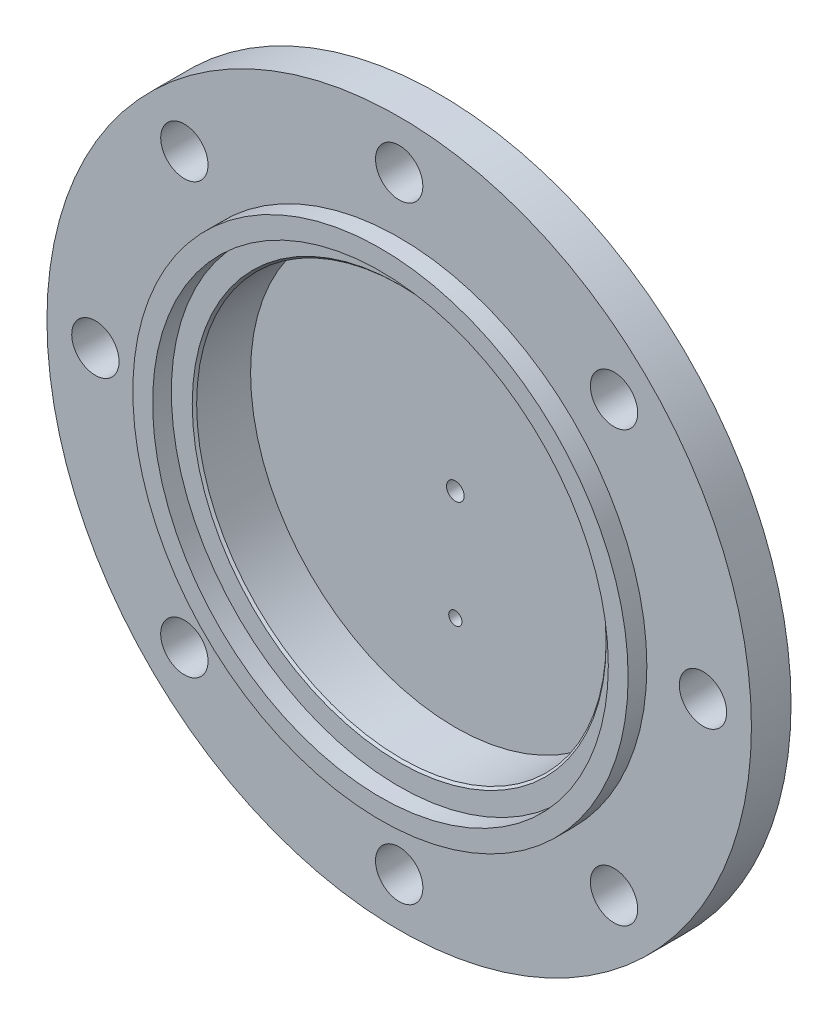
ISO-10303-21;
HEADER;
FILE_DESCRIPTION(('STEP AP214'),'2;1');
FILE_NAME('part.step','',(''),(''),'','','');
FILE_SCHEMA(('AUTOMOTIVE_DESIGN { 1 0 10303 214 1 1 1 1 }'));
ENDSEC;
DATA;
#1=APPLICATION_CONTEXT('core data for automotive mechanical design processes');
#2=APPLICATION_PROTOCOL_DEFINITION('international standard','automotive_design',2000,#1);
#3=PRODUCT_CONTEXT('',#1,'mechanical');
#4=PRODUCT('Part','Part','',(#3));
#5=PRODUCT_RELATED_PRODUCT_CATEGORY('part','',(#4));
#6=PRODUCT_DEFINITION_FORMATION('','',#4);
#7=PRODUCT_DEFINITION_CONTEXT('part definition',#1,'design');
#8=PRODUCT_DEFINITION('design','',#6,#7);
#9=PRODUCT_DEFINITION_SHAPE('','',#8);
#10=(LENGTH_UNIT() NAMED_UNIT(*) SI_UNIT(.MILLI.,.METRE.));
#11=(NAMED_UNIT(*) PLANE_ANGLE_UNIT() SI_UNIT($,.RADIAN.));
#12=(NAMED_UNIT(*) SI_UNIT($,.STERADIAN.) SOLID_ANGLE_UNIT());
#13=UNCERTAINTY_MEASURE_WITH_UNIT(LENGTH_MEASURE(1.E-05),#10,'distance_accuracy_value','');
#14=(GEOMETRIC_REPRESENTATION_CONTEXT(3) GLOBAL_UNCERTAINTY_ASSIGNED_CONTEXT((#13)) GLOBAL_UNIT_ASSIGNED_CONTEXT((#10,
#11,#12)) REPRESENTATION_CONTEXT('',''));
#15=CARTESIAN_POINT('',(0.,0.,0.));
#16=DIRECTION('',(0.,0.,1.));
#17=DIRECTION('',(1.,0.,0.));
#18=AXIS2_PLACEMENT_3D('',#15,#16,#17);
#19=CARTESIAN_POINT('',(0.,0.,18.));
#20=DIRECTION('',(0.,0.,-1.));
#21=DIRECTION('',(-1.,0.,0.));
#22=AXIS2_PLACEMENT_3D('',#19,#20,#21);
#23=CYLINDRICAL_SURFACE('',#22,93.);
#24=CARTESIAN_POINT('',(0.,0.,17.));
#25=DIRECTION('',(0.,0.,1.));
#26=DIRECTION('',(1.,0.,0.));
#27=AXIS2_PLACEMENT_3D('',#24,#25,#26);
#28=CIRCLE('',#27,93.);
#29=CARTESIAN_POINT('',(93.,0.,17.));
#30=VERTEX_POINT('',#29);
#31=EDGE_CURVE('E52',#30,#30,#28,.T.);
#32=ORIENTED_EDGE('',*,*,#31,.T.);
#33=EDGE_LOOP('',(#32));
#34=FACE_BOUND('',#33,.T.);
#35=CARTESIAN_POINT('',(0.,0.,-7.5));
#36=DIRECTION('',(0.,0.,-1.));
#37=DIRECTION('',(-1.,0.,0.));
#38=AXIS2_PLACEMENT_3D('',#35,#36,#37);
#39=CIRCLE('',#38,93.);
#40=CARTESIAN_POINT('',(-93.,0.,-7.5));
#41=VERTEX_POINT('',#40);
#42=EDGE_CURVE('E74',#41,#41,#39,.T.);
#43=ORIENTED_EDGE('',*,*,#42,.T.);
#44=EDGE_LOOP('',(#43));
#45=FACE_BOUND('',#44,.T.);
#46=ADVANCED_FACE('F43',(#34,#45),#23,.F.);
#47=CARTESIAN_POINT('',(0.,0.,18.));
#48=DIRECTION('',(0.,0.,1.));
#49=DIRECTION('',(1.,0.,0.));
#50=AXIS2_PLACEMENT_3D('',#47,#48,#49);
#51=PLANE('',#50);
#52=CARTESIAN_POINT('',(0.,0.,18.));
#53=DIRECTION('',(0.,0.,1.));
#54=DIRECTION('',(1.,0.,0.));
#55=AXIS2_PLACEMENT_3D('',#52,#53,#54);
#56=CIRCLE('',#55,94.);
#57=CARTESIAN_POINT('',(94.,0.,18.));
#58=VERTEX_POINT('',#57);
#59=EDGE_CURVE('E10',#58,#58,#56,.F.);
#60=ORIENTED_EDGE('',*,*,#59,.T.);
#61=EDGE_LOOP('',(#60));
#62=FACE_BOUND('',#61,.T.);
#63=CARTESIAN_POINT('',(0.,0.,18.));
#64=DIRECTION('',(0.,0.,1.));
#65=DIRECTION('',(1.,0.,0.));
#66=AXIS2_PLACEMENT_3D('',#63,#64,#65);
#67=CIRCLE('',#66,103.5);
#68=CARTESIAN_POINT('',(103.5,0.,18.));
#69=VERTEX_POINT('',#68);
#70=EDGE_CURVE('E57',#69,#69,#67,.F.);
#71=ORIENTED_EDGE('',*,*,#70,.F.);
#72=EDGE_LOOP('',(#71));
#73=FACE_BOUND('',#72,.T.);
#74=ADVANCED_FACE('F150',(#62,#73),#51,.T.);
#75=CARTESIAN_POINT('',(0.,0.,0.));
#76=DIRECTION('',(0.,0.,1.));
#77=DIRECTION('',(1.,0.,0.));
#78=AXIS2_PLACEMENT_3D('',#75,#76,#77);
#79=PLANE('',#78);
#80=CARTESIAN_POINT('',(0.,0.,0.));
#81=DIRECTION('',(0.,0.,1.));
#82=DIRECTION('',(1.,0.,0.));
#83=AXIS2_PLACEMENT_3D('',#80,#81,#82);
#84=CIRCLE('',#83,160.);
#85=CARTESIAN_POINT('',(160.,0.,0.));
#86=VERTEX_POINT('',#85);
#87=EDGE_CURVE('E94',#86,#86,#84,.T.);
#88=ORIENTED_EDGE('',*,*,#87,.F.);
#89=EDGE_LOOP('',(#88));
#90=FACE_BOUND('',#89,.T.);
#91=CARTESIAN_POINT('',(0.,138.,0.));
#92=DIRECTION('',(0.,0.,1.));
#93=DIRECTION('',(1.,0.,0.));
#94=AXIS2_PLACEMENT_3D('',#91,#92,#93);
#95=CIRCLE('',#94,10.75);
#96=CARTESIAN_POINT('',(10.75,138.,0.));
#97=VERTEX_POINT('',#96);
#98=EDGE_CURVE('E89',#97,#97,#95,.T.);
#99=ORIENTED_EDGE('',*,*,#98,.T.);
#100=EDGE_LOOP('',(#99));
#101=FACE_BOUND('',#100,.T.);
#102=CARTESIAN_POINT('',(-97.5807358037437,97.5807358037434,0.));
#103=DIRECTION('',(0.,0.,1.));
#104=DIRECTION('',(0.707106781186546,0.707106781186549,0.));
#105=AXIS2_PLACEMENT_3D('',#102,#103,#104);
#106=CIRCLE('',#105,10.75);
#107=CARTESIAN_POINT('',(-89.9793379059884,105.182133701499,0.));
#108=VERTEX_POINT('',#107);
#109=EDGE_CURVE('E104',#108,#108,#106,.T.);
#110=ORIENTED_EDGE('',*,*,#109,.T.);
#111=EDGE_LOOP('',(#110));
#112=FACE_BOUND('',#111,.T.);
#113=CARTESIAN_POINT('',(-138.,-4.81824424760352E-13,0.));
#114=DIRECTION('',(0.,0.,1.));
#115=DIRECTION('',(0.,1.,0.));
#116=AXIS2_PLACEMENT_3D('',#113,#114,#115);
#117=CIRCLE('',#116,10.75);
#118=CARTESIAN_POINT('',(-138.,10.7499999999995,0.));
#119=VERTEX_POINT('',#118);
#120=EDGE_CURVE('E110',#119,#119,#117,.T.);
#121=ORIENTED_EDGE('',*,*,#120,.T.);
#122=EDGE_LOOP('',(#121));
#123=FACE_BOUND('',#122,.T.);
#124=CARTESIAN_POINT('',(-97.580735803743,-97.5807358037441,0.));
#125=DIRECTION('',(0.,0.,1.));
#126=DIRECTION('',(-0.707106781186551,0.707106781186544,0.));
#127=AXIS2_PLACEMENT_3D('',#124,#125,#126);
#128=CIRCLE('',#127,10.75);
#129=CARTESIAN_POINT('',(-105.182133701498,-89.9793379059887,0.));
#130=VERTEX_POINT('',#129);
#131=EDGE_CURVE('E116',#130,#130,#128,.T.);
#132=ORIENTED_EDGE('',*,*,#131,.T.);
#133=EDGE_LOOP('',(#132));
#134=FACE_BOUND('',#133,.T.);
#135=CARTESIAN_POINT('',(0.,-138.,0.));
#136=DIRECTION('',(0.,0.,1.));
#137=DIRECTION('',(-1.,0.,0.));
#138=AXIS2_PLACEMENT_3D('',#135,#136,#137);
#139=CIRCLE('',#138,10.75);
#140=CARTESIAN_POINT('',(-10.75,-138.,0.));
#141=VERTEX_POINT('',#140);
#142=EDGE_CURVE('E122',#141,#141,#139,.T.);
#143=ORIENTED_EDGE('',*,*,#142,.T.);
#144=EDGE_LOOP('',(#143));
#145=FACE_BOUND('',#144,.T.);
#146=CARTESIAN_POINT('',(97.5807358037444,-97.5807358037427,0.));
#147=DIRECTION('',(0.,0.,1.));
#148=DIRECTION('',(-0.707106781186541,-0.707106781186554,0.));
#149=AXIS2_PLACEMENT_3D('',#146,#147,#148);
#150=CIRCLE('',#149,10.75);
#151=CARTESIAN_POINT('',(89.9793379059891,-105.182133701498,0.));
#152=VERTEX_POINT('',#151);
#153=EDGE_CURVE('E128',#152,#152,#150,.T.);
#154=ORIENTED_EDGE('',*,*,#153,.T.);
#155=EDGE_LOOP('',(#154));
#156=FACE_BOUND('',#155,.T.);
#157=CARTESIAN_POINT('',(138.,1.44547327428106E-12,0.));
#158=DIRECTION('',(0.,0.,1.));
#159=DIRECTION('',(0.,-1.,0.));
#160=AXIS2_PLACEMENT_3D('',#157,#158,#159);
#161=CIRCLE('',#160,10.75);
#162=CARTESIAN_POINT('',(138.,-10.7499999999986,0.));
#163=VERTEX_POINT('',#162);
#164=EDGE_CURVE('E134',#163,#163,#161,.T.);
#165=ORIENTED_EDGE('',*,*,#164,.T.);
#166=EDGE_LOOP('',(#165));
#167=FACE_BOUND('',#166,.T.);
#168=CARTESIAN_POINT('',(97.5807358037424,97.5807358037448,0.));
#169=DIRECTION('',(0.,0.,1.));
#170=DIRECTION('',(0.707106781186556,-0.707106781186539,0.));
#171=AXIS2_PLACEMENT_3D('',#168,#169,#170);
#172=CIRCLE('',#171,10.75);
#173=CARTESIAN_POINT('',(105.182133701498,89.9793379059895,0.));
#174=VERTEX_POINT('',#173);
#175=EDGE_CURVE('E140',#174,#174,#172,.T.);
#176=ORIENTED_EDGE('',*,*,#175,.T.);
#177=EDGE_LOOP('',(#176));
#178=FACE_BOUND('',#177,.T.);
#179=CARTESIAN_POINT('',(0.,0.,0.));
#180=DIRECTION('',(0.,0.,1.));
#181=DIRECTION('',(1.,0.,0.));
#182=AXIS2_PLACEMENT_3D('',#179,#180,#181);
#183=CIRCLE('',#182,108.);
#184=CARTESIAN_POINT('',(108.,0.,0.));
#185=VERTEX_POINT('',#184);
#186=EDGE_CURVE('E143',#185,#185,#183,.F.);
#187=ORIENTED_EDGE('',*,*,#186,.F.);
#188=EDGE_LOOP('',(#187));
#189=FACE_BOUND('',#188,.T.);
#190=ADVANCED_FACE('F152',(#90,#101,#112,#123,#134,#145,#156,#167,#178,#189),#79,.F.);
#191=CARTESIAN_POINT('',(97.5807358037424,97.5807358037448,18.));
#192=DIRECTION('',(0.,0.,-1.));
#193=DIRECTION('',(-0.707106781186556,0.707106781186539,0.));
#194=AXIS2_PLACEMENT_3D('',#191,#192,#193);
#195=CYLINDRICAL_SURFACE('',#194,10.75);
#196=CARTESIAN_POINT('',(97.5807358037424,97.5807358037448,18.));
#197=DIRECTION('',(0.,0.,1.));
#198=DIRECTION('',(0.707106781186556,-0.707106781186539,0.));
#199=AXIS2_PLACEMENT_3D('',#196,#197,#198);
#200=CIRCLE('',#199,10.75);
#201=CARTESIAN_POINT('',(105.182133701498,89.9793379059895,18.));
#202=VERTEX_POINT('',#201);
#203=EDGE_CURVE('E137',#202,#202,#200,.T.);
#204=ORIENTED_EDGE('',*,*,#203,.T.);
#205=EDGE_LOOP('',(#204));
#206=FACE_BOUND('',#205,.T.);
#207=ORIENTED_EDGE('',*,*,#175,.F.);
#208=EDGE_LOOP('',(#207));
#209=FACE_BOUND('',#208,.T.);
#210=ADVANCED_FACE('F159',(#206,#209),#195,.F.);
#211=CARTESIAN_POINT('',(138.,1.44547327428106E-12,18.));
#212=DIRECTION('',(0.,0.,-1.));
#213=DIRECTION('',(0.,1.,0.));
#214=AXIS2_PLACEMENT_3D('',#211,#212,#213);
#215=CYLINDRICAL_SURFACE('',#214,10.75);
#216=CARTESIAN_POINT('',(138.,1.44547327428106E-12,18.));
#217=DIRECTION('',(0.,0.,1.));
#218=DIRECTION('',(0.,-1.,0.));
#219=AXIS2_PLACEMENT_3D('',#216,#217,#218);
#220=CIRCLE('',#219,10.75);
#221=CARTESIAN_POINT('',(138.,-10.7499999999986,18.));
#222=VERTEX_POINT('',#221);
#223=EDGE_CURVE('E131',#222,#222,#220,.T.);
#224=ORIENTED_EDGE('',*,*,#223,.T.);
#225=EDGE_LOOP('',(#224));
#226=FACE_BOUND('',#225,.T.);
#227=ORIENTED_EDGE('',*,*,#164,.F.);
#228=EDGE_LOOP('',(#227));
#229=FACE_BOUND('',#228,.T.);
#230=ADVANCED_FACE('F357',(#226,#229),#215,.F.);
#231=CARTESIAN_POINT('',(97.5807358037444,-97.5807358037427,18.));
#232=DIRECTION('',(0.,0.,-1.));
#233=DIRECTION('',(0.707106781186541,0.707106781186554,0.));
#234=AXIS2_PLACEMENT_3D('',#231,#232,#233);
#235=CYLINDRICAL_SURFACE('',#234,10.75);
#236=CARTESIAN_POINT('',(97.5807358037444,-97.5807358037427,18.));
#237=DIRECTION('',(0.,0.,1.));
#238=DIRECTION('',(-0.707106781186541,-0.707106781186554,0.));
#239=AXIS2_PLACEMENT_3D('',#236,#237,#238);
#240=CIRCLE('',#239,10.75);
#241=CARTESIAN_POINT('',(89.9793379059891,-105.182133701498,18.));
#242=VERTEX_POINT('',#241);
#243=EDGE_CURVE('E125',#242,#242,#240,.T.);
#244=ORIENTED_EDGE('',*,*,#243,.T.);
#245=EDGE_LOOP('',(#244));
#246=FACE_BOUND('',#245,.T.);
#247=ORIENTED_EDGE('',*,*,#153,.F.);
#248=EDGE_LOOP('',(#247));
#249=FACE_BOUND('',#248,.T.);
#250=ADVANCED_FACE('F346',(#246,#249),#235,.F.);
#251=CARTESIAN_POINT('',(0.,-138.,18.));
#252=DIRECTION('',(0.,0.,-1.));
#253=DIRECTION('',(1.,0.,0.));
#254=AXIS2_PLACEMENT_3D('',#251,#252,#253);
#255=CYLINDRICAL_SURFACE('',#254,10.75);
#256=CARTESIAN_POINT('',(0.,-138.,18.));
#257=DIRECTION('',(0.,0.,1.));
#258=DIRECTION('',(-1.,0.,0.));
#259=AXIS2_PLACEMENT_3D('',#256,#257,#258);
#260=CIRCLE('',#259,10.75);
#261=CARTESIAN_POINT('',(-10.75,-138.,18.));
#262=VERTEX_POINT('',#261);
#263=EDGE_CURVE('E119',#262,#262,#260,.T.);
#264=ORIENTED_EDGE('',*,*,#263,.T.);
#265=EDGE_LOOP('',(#264));
#266=FACE_BOUND('',#265,.T.);
#267=ORIENTED_EDGE('',*,*,#142,.F.);
#268=EDGE_LOOP('',(#267));
#269=FACE_BOUND('',#268,.T.);
#270=ADVANCED_FACE('F335',(#266,#269),#255,.F.);
#271=CARTESIAN_POINT('',(-97.580735803743,-97.5807358037441,18.));
#272=DIRECTION('',(0.,0.,-1.));
#273=DIRECTION('',(0.707106781186551,-0.707106781186544,0.));
#274=AXIS2_PLACEMENT_3D('',#271,#272,#273);
#275=CYLINDRICAL_SURFACE('',#274,10.75);
#276=CARTESIAN_POINT('',(-97.580735803743,-97.5807358037441,18.));
#277=DIRECTION('',(0.,0.,1.));
#278=DIRECTION('',(-0.707106781186551,0.707106781186544,0.));
#279=AXIS2_PLACEMENT_3D('',#276,#277,#278);
#280=CIRCLE('',#279,10.75);
#281=CARTESIAN_POINT('',(-105.182133701498,-89.9793379059887,18.));
#282=VERTEX_POINT('',#281);
#283=EDGE_CURVE('E113',#282,#282,#280,.T.);
#284=ORIENTED_EDGE('',*,*,#283,.T.);
#285=EDGE_LOOP('',(#284));
#286=FACE_BOUND('',#285,.T.);
#287=ORIENTED_EDGE('',*,*,#131,.F.);
#288=EDGE_LOOP('',(#287));
#289=FACE_BOUND('',#288,.T.);
#290=ADVANCED_FACE('F324',(#286,#289),#275,.F.);
#291=CARTESIAN_POINT('',(-138.,-4.81824424760352E-13,18.));
#292=DIRECTION('',(0.,0.,-1.));
#293=DIRECTION('',(0.,-1.,0.));
#294=AXIS2_PLACEMENT_3D('',#291,#292,#293);
#295=CYLINDRICAL_SURFACE('',#294,10.75);
#296=CARTESIAN_POINT('',(-138.,-4.81824424760352E-13,18.));
#297=DIRECTION('',(0.,0.,1.));
#298=DIRECTION('',(0.,1.,0.));
#299=AXIS2_PLACEMENT_3D('',#296,#297,#298);
#300=CIRCLE('',#299,10.75);
#301=CARTESIAN_POINT('',(-138.,10.7499999999995,18.));
#302=VERTEX_POINT('',#301);
#303=EDGE_CURVE('E107',#302,#302,#300,.T.);
#304=ORIENTED_EDGE('',*,*,#303,.T.);
#305=EDGE_LOOP('',(#304));
#306=FACE_BOUND('',#305,.T.);
#307=ORIENTED_EDGE('',*,*,#120,.F.);
#308=EDGE_LOOP('',(#307));
#309=FACE_BOUND('',#308,.T.);
#310=ADVANCED_FACE('F311',(#306,#309),#295,.F.);
#311=CARTESIAN_POINT('',(-97.5807358037437,97.5807358037434,18.));
#312=DIRECTION('',(0.,0.,-1.));
#313=DIRECTION('',(-0.707106781186546,-0.707106781186549,0.));
#314=AXIS2_PLACEMENT_3D('',#311,#312,#313);
#315=CYLINDRICAL_SURFACE('',#314,10.75);
#316=CARTESIAN_POINT('',(-97.5807358037437,97.5807358037434,18.));
#317=DIRECTION('',(0.,0.,1.));
#318=DIRECTION('',(0.707106781186546,0.707106781186549,0.));
#319=AXIS2_PLACEMENT_3D('',#316,#317,#318);
#320=CIRCLE('',#319,10.75);
#321=CARTESIAN_POINT('',(-89.9793379059884,105.182133701499,18.));
#322=VERTEX_POINT('',#321);
#323=EDGE_CURVE('E97',#322,#322,#320,.T.);
#324=ORIENTED_EDGE('',*,*,#323,.T.);
#325=EDGE_LOOP('',(#324));
#326=FACE_BOUND('',#325,.T.);
#327=ORIENTED_EDGE('',*,*,#109,.F.);
#328=EDGE_LOOP('',(#327));
#329=FACE_BOUND('',#328,.T.);
#330=ADVANCED_FACE('F306',(#326,#329),#315,.F.);
#331=CARTESIAN_POINT('',(0.,138.,18.));
#332=DIRECTION('',(0.,0.,-1.));
#333=DIRECTION('',(-1.,0.,0.));
#334=AXIS2_PLACEMENT_3D('',#331,#332,#333);
#335=CYLINDRICAL_SURFACE('',#334,10.75);
#336=CARTESIAN_POINT('',(0.,138.,18.));
#337=DIRECTION('',(0.,0.,1.));
#338=DIRECTION('',(1.,0.,0.));
#339=AXIS2_PLACEMENT_3D('',#336,#337,#338);
#340=CIRCLE('',#339,10.75);
#341=CARTESIAN_POINT('',(10.75,138.,18.));
#342=VERTEX_POINT('',#341);
#343=EDGE_CURVE('E90',#342,#342,#340,.T.);
#344=ORIENTED_EDGE('',*,*,#343,.T.);
#345=EDGE_LOOP('',(#344));
#346=FACE_BOUND('',#345,.T.);
#347=ORIENTED_EDGE('',*,*,#98,.F.);
#348=EDGE_LOOP('',(#347));
#349=FACE_BOUND('',#348,.T.);
#350=ADVANCED_FACE('F176',(#346,#349),#335,.F.);
#351=CARTESIAN_POINT('',(0.,0.,18.));
#352=DIRECTION('',(0.,0.,-1.));
#353=DIRECTION('',(-1.,0.,0.));
#354=AXIS2_PLACEMENT_3D('',#351,#352,#353);
#355=CYLINDRICAL_SURFACE('',#354,160.);
#356=CARTESIAN_POINT('',(0.,0.,18.));
#357=DIRECTION('',(0.,0.,1.));
#358=DIRECTION('',(1.,0.,0.));
#359=AXIS2_PLACEMENT_3D('',#356,#357,#358);
#360=CIRCLE('',#359,160.);
#361=CARTESIAN_POINT('',(160.,0.,18.));
#362=VERTEX_POINT('',#361);
#363=EDGE_CURVE('E93',#362,#362,#360,.T.);
#364=ORIENTED_EDGE('',*,*,#363,.F.);
#365=EDGE_LOOP('',(#364));
#366=FACE_BOUND('',#365,.T.);
#367=ORIENTED_EDGE('',*,*,#87,.T.);
#368=EDGE_LOOP('',(#367));
#369=FACE_BOUND('',#368,.T.);
#370=ADVANCED_FACE('F167',(#366,#369),#355,.T.);
#371=CARTESIAN_POINT('',(0.,0.,18.));
#372=DIRECTION('',(0.,0.,1.));
#373=DIRECTION('',(1.,0.,0.));
#374=AXIS2_PLACEMENT_3D('',#371,#372,#373);
#375=CIRCLE('',#374,112.5);
#376=CARTESIAN_POINT('',(112.5,0.,18.));
#377=VERTEX_POINT('',#376);
#378=EDGE_CURVE('E80',#377,#377,#375,.T.);
#379=ORIENTED_EDGE('',*,*,#378,.F.);
#380=EDGE_LOOP('',(#379));
#381=FACE_BOUND('',#380,.T.);
#382=ORIENTED_EDGE('',*,*,#203,.F.);
#383=EDGE_LOOP('',(#382));
#384=FACE_BOUND('',#383,.T.);
#385=ORIENTED_EDGE('',*,*,#223,.F.);
#386=EDGE_LOOP('',(#385));
#387=FACE_BOUND('',#386,.T.);
#388=ORIENTED_EDGE('',*,*,#243,.F.);
#389=EDGE_LOOP('',(#388));
#390=FACE_BOUND('',#389,.T.);
#391=ORIENTED_EDGE('',*,*,#263,.F.);
#392=EDGE_LOOP('',(#391));
#393=FACE_BOUND('',#392,.T.);
#394=ORIENTED_EDGE('',*,*,#283,.F.);
#395=EDGE_LOOP('',(#394));
#396=FACE_BOUND('',#395,.T.);
#397=ORIENTED_EDGE('',*,*,#303,.F.);
#398=EDGE_LOOP('',(#397));
#399=FACE_BOUND('',#398,.T.);
#400=ORIENTED_EDGE('',*,*,#323,.F.);
#401=EDGE_LOOP('',(#400));
#402=FACE_BOUND('',#401,.T.);
#403=ORIENTED_EDGE('',*,*,#343,.F.);
#404=EDGE_LOOP('',(#403));
#405=FACE_BOUND('',#404,.T.);
#406=ORIENTED_EDGE('',*,*,#363,.T.);
#407=EDGE_LOOP('',(#406));
#408=FACE_BOUND('',#407,.T.);
#409=ADVANCED_FACE('F154',(#381,#384,#387,#390,#393,#396,#399,#402,#405,#408),#51,.T.);
#410=CARTESIAN_POINT('',(0.,0.,-18.));
#411=DIRECTION('',(0.,0.,-1.));
#412=DIRECTION('',(-1.,0.,0.));
#413=AXIS2_PLACEMENT_3D('',#410,#411,#412);
#414=PLANE('',#413);
#415=CARTESIAN_POINT('',(0.,0.,-18.));
#416=DIRECTION('',(0.,0.,-1.));
#417=DIRECTION('',(-1.,0.,0.));
#418=AXIS2_PLACEMENT_3D('',#415,#416,#417);
#419=CIRCLE('',#418,4.);
#420=CARTESIAN_POINT('',(-4.,0.,-18.));
#421=VERTEX_POINT('',#420);
#422=EDGE_CURVE('E70',#421,#421,#419,.T.);
#423=ORIENTED_EDGE('',*,*,#422,.F.);
#424=EDGE_LOOP('',(#423));
#425=FACE_BOUND('',#424,.T.);
#426=CARTESIAN_POINT('',(0.,-50.,-18.));
#427=DIRECTION('',(0.,0.,-1.));
#428=DIRECTION('',(-1.,0.,0.));
#429=AXIS2_PLACEMENT_3D('',#426,#427,#428);
#430=CIRCLE('',#429,3.);
#431=CARTESIAN_POINT('',(-3.00000000000001,-50.,-18.));
#432=VERTEX_POINT('',#431);
#433=EDGE_CURVE('E62',#432,#432,#430,.T.);
#434=ORIENTED_EDGE('',*,*,#433,.F.);
#435=EDGE_LOOP('',(#434));
#436=FACE_BOUND('',#435,.T.);
#437=CARTESIAN_POINT('',(0.,0.,-18.));
#438=DIRECTION('',(0.,0.,-1.));
#439=DIRECTION('',(-1.,0.,0.));
#440=AXIS2_PLACEMENT_3D('',#437,#438,#439);
#441=CIRCLE('',#440,108.);
#442=CARTESIAN_POINT('',(-108.,0.,-18.));
#443=VERTEX_POINT('',#442);
#444=EDGE_CURVE('E84',#443,#443,#441,.T.);
#445=ORIENTED_EDGE('',*,*,#444,.T.);
#446=EDGE_LOOP('',(#445));
#447=FACE_BOUND('',#446,.T.);
#448=ADVANCED_FACE('F166',(#425,#436,#447),#414,.T.);
#449=CARTESIAN_POINT('',(0.,0.,-18.));
#450=DIRECTION('',(0.,0.,1.));
#451=DIRECTION('',(1.,0.,0.));
#452=AXIS2_PLACEMENT_3D('',#449,#450,#451);
#453=CYLINDRICAL_SURFACE('',#452,108.);
#454=ORIENTED_EDGE('',*,*,#444,.F.);
#455=EDGE_LOOP('',(#454));
#456=FACE_BOUND('',#455,.T.);
#457=ORIENTED_EDGE('',*,*,#186,.T.);
#458=EDGE_LOOP('',(#457));
#459=FACE_BOUND('',#458,.T.);
#460=ADVANCED_FACE('F173',(#456,#459),#453,.T.);
#461=CARTESIAN_POINT('',(0.,0.,26.5));
#462=DIRECTION('',(0.,0.,1.));
#463=DIRECTION('',(1.,0.,0.));
#464=AXIS2_PLACEMENT_3D('',#461,#462,#463);
#465=PLANE('',#464);
#466=CARTESIAN_POINT('',(0.,0.,26.5));
#467=DIRECTION('',(0.,0.,1.));
#468=DIRECTION('',(1.,0.,0.));
#469=AXIS2_PLACEMENT_3D('',#466,#467,#468);
#470=CIRCLE('',#469,112.5);
#471=CARTESIAN_POINT('',(112.5,0.,26.5));
#472=VERTEX_POINT('',#471);
#473=EDGE_CURVE('E81',#472,#472,#470,.T.);
#474=ORIENTED_EDGE('',*,*,#473,.T.);
#475=EDGE_LOOP('',(#474));
#476=FACE_BOUND('',#475,.T.);
#477=CARTESIAN_POINT('',(0.,0.,26.5));
#478=DIRECTION('',(0.,0.,1.));
#479=DIRECTION('',(1.,0.,0.));
#480=AXIS2_PLACEMENT_3D('',#477,#478,#479);
#481=CIRCLE('',#480,103.5);
#482=CARTESIAN_POINT('',(103.5,0.,26.5));
#483=VERTEX_POINT('',#482);
#484=EDGE_CURVE('E77',#483,#483,#481,.T.);
#485=ORIENTED_EDGE('',*,*,#484,.F.);
#486=EDGE_LOOP('',(#485));
#487=FACE_BOUND('',#486,.T.);
#488=ADVANCED_FACE('F220',(#476,#487),#465,.T.);
#489=CARTESIAN_POINT('',(0.,0.,26.5));
#490=DIRECTION('',(0.,0.,-1.));
#491=DIRECTION('',(-1.,0.,0.));
#492=AXIS2_PLACEMENT_3D('',#489,#490,#491);
#493=CYLINDRICAL_SURFACE('',#492,112.5);
#494=ORIENTED_EDGE('',*,*,#473,.F.);
#495=EDGE_LOOP('',(#494));
#496=FACE_BOUND('',#495,.T.);
#497=ORIENTED_EDGE('',*,*,#378,.T.);
#498=EDGE_LOOP('',(#497));
#499=FACE_BOUND('',#498,.T.);
#500=ADVANCED_FACE('F225',(#496,#499),#493,.T.);
#501=CARTESIAN_POINT('',(0.,0.,26.5));
#502=DIRECTION('',(0.,0.,-1.));
#503=DIRECTION('',(-1.,0.,0.));
#504=AXIS2_PLACEMENT_3D('',#501,#502,#503);
#505=CYLINDRICAL_SURFACE('',#504,103.5);
#506=ORIENTED_EDGE('',*,*,#484,.T.);
#507=EDGE_LOOP('',(#506));
#508=FACE_BOUND('',#507,.T.);
#509=ORIENTED_EDGE('',*,*,#70,.T.);
#510=EDGE_LOOP('',(#509));
#511=FACE_BOUND('',#510,.T.);
#512=ADVANCED_FACE('F148',(#508,#511),#505,.F.);
#513=CARTESIAN_POINT('',(0.,0.,17.));
#514=DIRECTION('',(0.,0.,1.));
#515=DIRECTION('',(1.,0.,0.));
#516=AXIS2_PLACEMENT_3D('',#513,#514,#515);
#517=CONICAL_SURFACE('',#516,93.,0.785398163397441);
#518=ORIENTED_EDGE('',*,*,#59,.F.);
#519=EDGE_LOOP('',(#518));
#520=FACE_BOUND('',#519,.T.);
#521=ORIENTED_EDGE('',*,*,#31,.F.);
#522=EDGE_LOOP('',(#521));
#523=FACE_BOUND('',#522,.T.);
#524=ADVANCED_FACE('F46',(#520,#523),#517,.F.);
#525=CARTESIAN_POINT('',(0.,0.,-7.5));
#526=DIRECTION('',(0.,0.,-1.));
#527=DIRECTION('',(-1.,0.,0.));
#528=AXIS2_PLACEMENT_3D('',#525,#526,#527);
#529=PLANE('',#528);
#530=CARTESIAN_POINT('',(0.,0.,-7.5));
#531=DIRECTION('',(0.,0.,-1.));
#532=DIRECTION('',(-1.,0.,0.));
#533=AXIS2_PLACEMENT_3D('',#530,#531,#532);
#534=CIRCLE('',#533,4.);
#535=CARTESIAN_POINT('',(-4.,0.,-7.5));
#536=VERTEX_POINT('',#535);
#537=EDGE_CURVE('E48',#536,#536,#534,.T.);
#538=ORIENTED_EDGE('',*,*,#537,.T.);
#539=EDGE_LOOP('',(#538));
#540=FACE_BOUND('',#539,.T.);
#541=CARTESIAN_POINT('',(0.,-50.,-7.5));
#542=DIRECTION('',(0.,0.,-1.));
#543=DIRECTION('',(-1.,0.,0.));
#544=AXIS2_PLACEMENT_3D('',#541,#542,#543);
#545=CIRCLE('',#544,3.);
#546=CARTESIAN_POINT('',(-3.00000000000001,-50.,-7.5));
#547=VERTEX_POINT('',#546);
#548=EDGE_CURVE('E60',#547,#547,#545,.T.);
#549=ORIENTED_EDGE('',*,*,#548,.T.);
#550=EDGE_LOOP('',(#549));
#551=FACE_BOUND('',#550,.T.);
#552=ORIENTED_EDGE('',*,*,#42,.F.);
#553=EDGE_LOOP('',(#552));
#554=FACE_BOUND('',#553,.T.);
#555=ADVANCED_FACE('F236',(#540,#551,#554),#529,.F.);
#556=CARTESIAN_POINT('',(0.,-50.,26.5));
#557=DIRECTION('',(0.,0.,-1.));
#558=DIRECTION('',(-1.,0.,0.));
#559=AXIS2_PLACEMENT_3D('',#556,#557,#558);
#560=CYLINDRICAL_SURFACE('',#559,3.);
#561=ORIENTED_EDGE('',*,*,#433,.T.);
#562=EDGE_LOOP('',(#561));
#563=FACE_BOUND('',#562,.T.);
#564=ORIENTED_EDGE('',*,*,#548,.F.);
#565=EDGE_LOOP('',(#564));
#566=FACE_BOUND('',#565,.T.);
#567=ADVANCED_FACE('F239',(#563,#566),#560,.F.);
#568=CARTESIAN_POINT('',(0.,0.,26.5));
#569=DIRECTION('',(0.,0.,-1.));
#570=DIRECTION('',(-1.,0.,0.));
#571=AXIS2_PLACEMENT_3D('',#568,#569,#570);
#572=CYLINDRICAL_SURFACE('',#571,4.);
#573=ORIENTED_EDGE('',*,*,#422,.T.);
#574=EDGE_LOOP('',(#573));
#575=FACE_BOUND('',#574,.T.);
#576=ORIENTED_EDGE('',*,*,#537,.F.);
#577=EDGE_LOOP('',(#576));
#578=FACE_BOUND('',#577,.T.);
#579=ADVANCED_FACE('F243',(#575,#578),#572,.F.);
#580=CLOSED_SHELL('',(#46,#74,#190,#210,#230,#250,#270,#290,#310,#330,#350,#370,#409,#448,#460,
#488,#500,#512,#524,#555,#567,#579));
#581=MANIFOLD_SOLID_BREP('B2',#580);
#582=ADVANCED_BREP_SHAPE_REPRESENTATION('',(#18,#581),#14);
#583=SHAPE_DEFINITION_REPRESENTATION(#9,#582);
ENDSEC;
END-ISO-10303-21;
